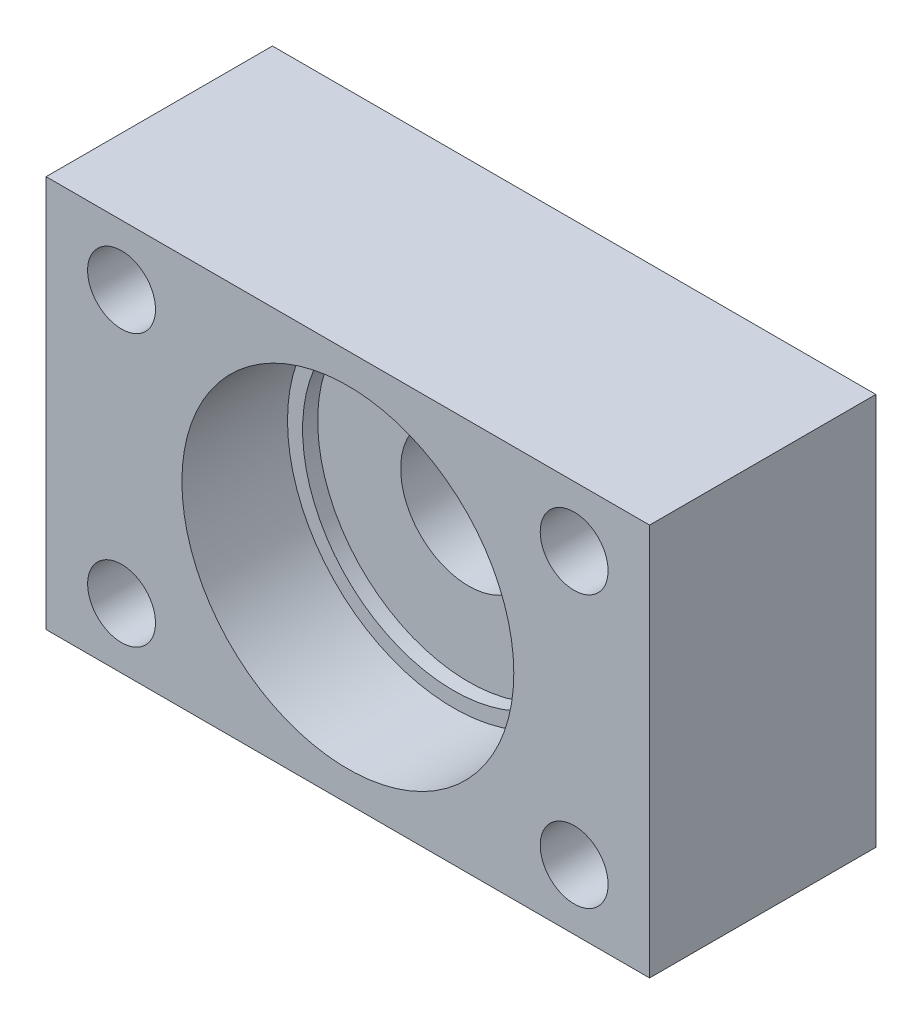
ISO-10303-21;
HEADER;
FILE_DESCRIPTION(('STEP AP214'),'2;1');
FILE_NAME('part.step','',(''),(''),'','','');
FILE_SCHEMA(('AUTOMOTIVE_DESIGN { 1 0 10303 214 1 1 1 1 }'));
ENDSEC;
DATA;
#1=APPLICATION_CONTEXT('core data for automotive mechanical design processes');
#2=APPLICATION_PROTOCOL_DEFINITION('international standard','automotive_design',2000,#1);
#3=PRODUCT_CONTEXT('',#1,'mechanical');
#4=PRODUCT('Part','Part','',(#3));
#5=PRODUCT_RELATED_PRODUCT_CATEGORY('part','',(#4));
#6=PRODUCT_DEFINITION_FORMATION('','',#4);
#7=PRODUCT_DEFINITION_CONTEXT('part definition',#1,'design');
#8=PRODUCT_DEFINITION('design','',#6,#7);
#9=PRODUCT_DEFINITION_SHAPE('','',#8);
#10=(LENGTH_UNIT() NAMED_UNIT(*) SI_UNIT(.MILLI.,.METRE.));
#11=(NAMED_UNIT(*) PLANE_ANGLE_UNIT() SI_UNIT($,.RADIAN.));
#12=(NAMED_UNIT(*) SI_UNIT($,.STERADIAN.) SOLID_ANGLE_UNIT());
#13=UNCERTAINTY_MEASURE_WITH_UNIT(LENGTH_MEASURE(1.E-05),#10,'distance_accuracy_value','');
#14=(GEOMETRIC_REPRESENTATION_CONTEXT(3) GLOBAL_UNCERTAINTY_ASSIGNED_CONTEXT((#13)) GLOBAL_UNIT_ASSIGNED_CONTEXT((#10,
#11,#12)) REPRESENTATION_CONTEXT('',''));
#15=CARTESIAN_POINT('',(0.,0.,0.));
#16=DIRECTION('',(0.,0.,1.));
#17=DIRECTION('',(1.,0.,0.));
#18=AXIS2_PLACEMENT_3D('',#15,#16,#17);
#19=CARTESIAN_POINT('',(0.,0.,15.));
#20=DIRECTION('',(1.,0.,0.));
#21=DIRECTION('',(0.,0.,-1.));
#22=AXIS2_PLACEMENT_3D('',#19,#20,#21);
#23=PLANE('',#22);
#24=DIRECTION('',(0.,-1.,0.));
#25=VECTOR('',#24,1.);
#26=CARTESIAN_POINT('',(0.,0.,0.));
#27=LINE('',#26,#25);
#28=CARTESIAN_POINT('',(0.,26.,0.));
#29=VERTEX_POINT('',#28);
#30=CARTESIAN_POINT('',(0.,0.,0.));
#31=VERTEX_POINT('',#30);
#32=EDGE_CURVE('E96',#29,#31,#27,.T.);
#33=ORIENTED_EDGE('',*,*,#32,.T.);
#34=DIRECTION('',(0.,0.,-1.));
#35=VECTOR('',#34,1.);
#36=CARTESIAN_POINT('',(0.,0.,15.));
#37=LINE('',#36,#35);
#38=CARTESIAN_POINT('',(0.,0.,15.));
#39=VERTEX_POINT('',#38);
#40=EDGE_CURVE('E11',#39,#31,#37,.T.);
#41=ORIENTED_EDGE('',*,*,#40,.F.);
#42=DIRECTION('',(0.,-1.,0.));
#43=VECTOR('',#42,1.);
#44=CARTESIAN_POINT('',(0.,0.,15.));
#45=LINE('',#44,#43);
#46=CARTESIAN_POINT('',(0.,26.,15.));
#47=VERTEX_POINT('',#46);
#48=EDGE_CURVE('E84',#47,#39,#45,.T.);
#49=ORIENTED_EDGE('',*,*,#48,.F.);
#50=DIRECTION('',(0.,0.,-1.));
#51=VECTOR('',#50,1.);
#52=CARTESIAN_POINT('',(0.,26.,15.));
#53=LINE('',#52,#51);
#54=EDGE_CURVE('E92',#47,#29,#53,.T.);
#55=ORIENTED_EDGE('',*,*,#54,.T.);
#56=EDGE_LOOP('',(#33,#41,#49,#55));
#57=FACE_BOUND('',#56,.T.);
#58=ADVANCED_FACE('F33',(#57),#23,.F.);
#59=CARTESIAN_POINT('',(0.,0.,15.));
#60=DIRECTION('',(0.,1.,0.));
#61=DIRECTION('',(0.,0.,1.));
#62=AXIS2_PLACEMENT_3D('',#59,#60,#61);
#63=PLANE('',#62);
#64=DIRECTION('',(1.,0.,0.));
#65=VECTOR('',#64,1.);
#66=CARTESIAN_POINT('',(0.,0.,0.));
#67=LINE('',#66,#65);
#68=CARTESIAN_POINT('',(40.,0.,0.));
#69=VERTEX_POINT('',#68);
#70=EDGE_CURVE('E88',#31,#69,#67,.T.);
#71=ORIENTED_EDGE('',*,*,#70,.T.);
#72=DIRECTION('',(0.,0.,-1.));
#73=VECTOR('',#72,1.);
#74=CARTESIAN_POINT('',(40.,0.,15.));
#75=LINE('',#74,#73);
#76=CARTESIAN_POINT('',(40.,0.,15.));
#77=VERTEX_POINT('',#76);
#78=EDGE_CURVE('E41',#77,#69,#75,.T.);
#79=ORIENTED_EDGE('',*,*,#78,.F.);
#80=DIRECTION('',(1.,0.,0.));
#81=VECTOR('',#80,1.);
#82=CARTESIAN_POINT('',(0.,0.,15.));
#83=LINE('',#82,#81);
#84=EDGE_CURVE('E79',#39,#77,#83,.T.);
#85=ORIENTED_EDGE('',*,*,#84,.F.);
#86=ORIENTED_EDGE('',*,*,#40,.T.);
#87=EDGE_LOOP('',(#71,#79,#85,#86));
#88=FACE_BOUND('',#87,.T.);
#89=ADVANCED_FACE('F87',(#88),#63,.F.);
#90=CARTESIAN_POINT('',(40.,0.,15.));
#91=DIRECTION('',(-1.,0.,0.));
#92=DIRECTION('',(0.,0.,1.));
#93=AXIS2_PLACEMENT_3D('',#90,#91,#92);
#94=PLANE('',#93);
#95=DIRECTION('',(0.,1.,0.));
#96=VECTOR('',#95,1.);
#97=CARTESIAN_POINT('',(40.,0.,0.));
#98=LINE('',#97,#96);
#99=CARTESIAN_POINT('',(40.,26.,0.));
#100=VERTEX_POINT('',#99);
#101=EDGE_CURVE('E66',#69,#100,#98,.T.);
#102=ORIENTED_EDGE('',*,*,#101,.T.);
#103=DIRECTION('',(0.,0.,-1.));
#104=VECTOR('',#103,1.);
#105=CARTESIAN_POINT('',(40.,26.,15.));
#106=LINE('',#105,#104);
#107=CARTESIAN_POINT('',(40.,26.,15.));
#108=VERTEX_POINT('',#107);
#109=EDGE_CURVE('E89',#108,#100,#106,.T.);
#110=ORIENTED_EDGE('',*,*,#109,.F.);
#111=DIRECTION('',(0.,1.,0.));
#112=VECTOR('',#111,1.);
#113=CARTESIAN_POINT('',(40.,0.,15.));
#114=LINE('',#113,#112);
#115=EDGE_CURVE('E82',#77,#108,#114,.T.);
#116=ORIENTED_EDGE('',*,*,#115,.F.);
#117=ORIENTED_EDGE('',*,*,#78,.T.);
#118=EDGE_LOOP('',(#102,#110,#116,#117));
#119=FACE_BOUND('',#118,.T.);
#120=ADVANCED_FACE('F90',(#119),#94,.F.);
#121=CARTESIAN_POINT('',(0.,26.,15.));
#122=DIRECTION('',(0.,-1.,0.));
#123=DIRECTION('',(0.,0.,-1.));
#124=AXIS2_PLACEMENT_3D('',#121,#122,#123);
#125=PLANE('',#124);
#126=DIRECTION('',(-1.,0.,0.));
#127=VECTOR('',#126,1.);
#128=CARTESIAN_POINT('',(0.,26.,0.));
#129=LINE('',#128,#127);
#130=EDGE_CURVE('E72',#100,#29,#129,.T.);
#131=ORIENTED_EDGE('',*,*,#130,.T.);
#132=ORIENTED_EDGE('',*,*,#54,.F.);
#133=DIRECTION('',(-1.,0.,0.));
#134=VECTOR('',#133,1.);
#135=CARTESIAN_POINT('',(0.,26.,15.));
#136=LINE('',#135,#134);
#137=EDGE_CURVE('E49',#108,#47,#136,.T.);
#138=ORIENTED_EDGE('',*,*,#137,.F.);
#139=ORIENTED_EDGE('',*,*,#109,.T.);
#140=EDGE_LOOP('',(#131,#132,#138,#139));
#141=FACE_BOUND('',#140,.T.);
#142=ADVANCED_FACE('F104',(#141),#125,.F.);
#143=CARTESIAN_POINT('',(0.,0.,15.));
#144=DIRECTION('',(0.,0.,-1.));
#145=DIRECTION('',(-1.,0.,0.));
#146=AXIS2_PLACEMENT_3D('',#143,#144,#145);
#147=PLANE('',#146);
#148=CARTESIAN_POINT('',(5.,4.,15.));
#149=DIRECTION('',(0.,0.,1.));
#150=DIRECTION('',(-1.,0.,0.));
#151=AXIS2_PLACEMENT_3D('',#148,#149,#150);
#152=CIRCLE('',#151,2.25);
#153=CARTESIAN_POINT('',(2.75,4.,15.));
#154=VERTEX_POINT('',#153);
#155=EDGE_CURVE('E146',#154,#154,#152,.T.);
#156=ORIENTED_EDGE('',*,*,#155,.F.);
#157=EDGE_LOOP('',(#156));
#158=FACE_BOUND('',#157,.T.);
#159=CARTESIAN_POINT('',(35.,4.,15.));
#160=DIRECTION('',(0.,0.,1.));
#161=DIRECTION('',(1.,0.,0.));
#162=AXIS2_PLACEMENT_3D('',#159,#160,#161);
#163=CIRCLE('',#162,2.25);
#164=CARTESIAN_POINT('',(37.25,4.,15.));
#165=VERTEX_POINT('',#164);
#166=EDGE_CURVE('E140',#165,#165,#163,.T.);
#167=ORIENTED_EDGE('',*,*,#166,.F.);
#168=EDGE_LOOP('',(#167));
#169=FACE_BOUND('',#168,.T.);
#170=CARTESIAN_POINT('',(35.,22.,15.));
#171=DIRECTION('',(0.,0.,1.));
#172=DIRECTION('',(-1.,0.,0.));
#173=AXIS2_PLACEMENT_3D('',#170,#171,#172);
#174=CIRCLE('',#173,2.25);
#175=CARTESIAN_POINT('',(32.75,22.,15.));
#176=VERTEX_POINT('',#175);
#177=EDGE_CURVE('E134',#176,#176,#174,.T.);
#178=ORIENTED_EDGE('',*,*,#177,.F.);
#179=EDGE_LOOP('',(#178));
#180=FACE_BOUND('',#179,.T.);
#181=CARTESIAN_POINT('',(5.,22.,15.));
#182=DIRECTION('',(0.,0.,1.));
#183=DIRECTION('',(1.,0.,0.));
#184=AXIS2_PLACEMENT_3D('',#181,#182,#183);
#185=CIRCLE('',#184,2.25);
#186=CARTESIAN_POINT('',(7.25,22.,15.));
#187=VERTEX_POINT('',#186);
#188=EDGE_CURVE('E128',#187,#187,#185,.T.);
#189=ORIENTED_EDGE('',*,*,#188,.F.);
#190=EDGE_LOOP('',(#189));
#191=FACE_BOUND('',#190,.T.);
#192=CARTESIAN_POINT('',(20.,13.,15.));
#193=DIRECTION('',(0.,0.,1.));
#194=DIRECTION('',(1.,0.,0.));
#195=AXIS2_PLACEMENT_3D('',#192,#193,#194);
#196=CIRCLE('',#195,11.);
#197=CARTESIAN_POINT('',(31.,13.,15.));
#198=VERTEX_POINT('',#197);
#199=EDGE_CURVE('E110',#198,#198,#196,.T.);
#200=ORIENTED_EDGE('',*,*,#199,.F.);
#201=EDGE_LOOP('',(#200));
#202=FACE_BOUND('',#201,.T.);
#203=ORIENTED_EDGE('',*,*,#48,.T.);
#204=ORIENTED_EDGE('',*,*,#84,.T.);
#205=ORIENTED_EDGE('',*,*,#115,.T.);
#206=ORIENTED_EDGE('',*,*,#137,.T.);
#207=EDGE_LOOP('',(#203,#204,#205,#206));
#208=FACE_BOUND('',#207,.T.);
#209=ADVANCED_FACE('F80',(#158,#169,#180,#191,#202,#208),#147,.F.);
#210=CARTESIAN_POINT('',(0.,0.,0.));
#211=DIRECTION('',(0.,0.,-1.));
#212=DIRECTION('',(-1.,0.,0.));
#213=AXIS2_PLACEMENT_3D('',#210,#211,#212);
#214=PLANE('',#213);
#215=CARTESIAN_POINT('',(5.,4.,0.));
#216=DIRECTION('',(0.,0.,1.));
#217=DIRECTION('',(-1.,0.,0.));
#218=AXIS2_PLACEMENT_3D('',#215,#216,#217);
#219=CIRCLE('',#218,2.25);
#220=CARTESIAN_POINT('',(2.75,4.,0.));
#221=VERTEX_POINT('',#220);
#222=EDGE_CURVE('E131',#221,#221,#219,.T.);
#223=ORIENTED_EDGE('',*,*,#222,.T.);
#224=EDGE_LOOP('',(#223));
#225=FACE_BOUND('',#224,.T.);
#226=CARTESIAN_POINT('',(35.,4.,0.));
#227=DIRECTION('',(0.,0.,1.));
#228=DIRECTION('',(1.,0.,0.));
#229=AXIS2_PLACEMENT_3D('',#226,#227,#228);
#230=CIRCLE('',#229,2.25);
#231=CARTESIAN_POINT('',(37.25,4.,0.));
#232=VERTEX_POINT('',#231);
#233=EDGE_CURVE('E143',#232,#232,#230,.T.);
#234=ORIENTED_EDGE('',*,*,#233,.T.);
#235=EDGE_LOOP('',(#234));
#236=FACE_BOUND('',#235,.T.);
#237=CARTESIAN_POINT('',(35.,22.,0.));
#238=DIRECTION('',(0.,0.,1.));
#239=DIRECTION('',(-1.,0.,0.));
#240=AXIS2_PLACEMENT_3D('',#237,#238,#239);
#241=CIRCLE('',#240,2.25);
#242=CARTESIAN_POINT('',(32.75,22.,0.));
#243=VERTEX_POINT('',#242);
#244=EDGE_CURVE('E137',#243,#243,#241,.T.);
#245=ORIENTED_EDGE('',*,*,#244,.T.);
#246=EDGE_LOOP('',(#245));
#247=FACE_BOUND('',#246,.T.);
#248=CARTESIAN_POINT('',(5.,22.,0.));
#249=DIRECTION('',(0.,0.,1.));
#250=DIRECTION('',(1.,0.,0.));
#251=AXIS2_PLACEMENT_3D('',#248,#249,#250);
#252=CIRCLE('',#251,2.25);
#253=CARTESIAN_POINT('',(7.25,22.,0.));
#254=VERTEX_POINT('',#253);
#255=EDGE_CURVE('E125',#254,#254,#252,.T.);
#256=ORIENTED_EDGE('',*,*,#255,.T.);
#257=EDGE_LOOP('',(#256));
#258=FACE_BOUND('',#257,.T.);
#259=CARTESIAN_POINT('',(20.,13.,0.));
#260=DIRECTION('',(0.,0.,1.));
#261=DIRECTION('',(1.,0.,0.));
#262=AXIS2_PLACEMENT_3D('',#259,#260,#261);
#263=CIRCLE('',#262,4.5);
#264=CARTESIAN_POINT('',(24.5,13.,0.));
#265=VERTEX_POINT('',#264);
#266=EDGE_CURVE('E119',#265,#265,#263,.T.);
#267=ORIENTED_EDGE('',*,*,#266,.T.);
#268=EDGE_LOOP('',(#267));
#269=FACE_BOUND('',#268,.T.);
#270=ORIENTED_EDGE('',*,*,#32,.F.);
#271=ORIENTED_EDGE('',*,*,#130,.F.);
#272=ORIENTED_EDGE('',*,*,#101,.F.);
#273=ORIENTED_EDGE('',*,*,#70,.F.);
#274=EDGE_LOOP('',(#270,#271,#272,#273));
#275=FACE_BOUND('',#274,.T.);
#276=ADVANCED_FACE('F107',(#225,#236,#247,#258,#269,#275),#214,.T.);
#277=CARTESIAN_POINT('',(20.,13.,8.));
#278=DIRECTION('',(0.,0.,1.));
#279=DIRECTION('',(1.,0.,0.));
#280=AXIS2_PLACEMENT_3D('',#277,#278,#279);
#281=CYLINDRICAL_SURFACE('',#280,11.);
#282=CARTESIAN_POINT('',(20.,13.,8.));
#283=DIRECTION('',(0.,0.,1.));
#284=DIRECTION('',(1.,0.,0.));
#285=AXIS2_PLACEMENT_3D('',#282,#283,#284);
#286=CIRCLE('',#285,11.);
#287=CARTESIAN_POINT('',(31.,13.,8.));
#288=VERTEX_POINT('',#287);
#289=EDGE_CURVE('E99',#288,#288,#286,.T.);
#290=ORIENTED_EDGE('',*,*,#289,.F.);
#291=EDGE_LOOP('',(#290));
#292=FACE_BOUND('',#291,.T.);
#293=ORIENTED_EDGE('',*,*,#199,.T.);
#294=EDGE_LOOP('',(#293));
#295=FACE_BOUND('',#294,.T.);
#296=ADVANCED_FACE('F172',(#292,#295),#281,.F.);
#297=CARTESIAN_POINT('',(20.,13.,8.));
#298=DIRECTION('',(0.,0.,1.));
#299=DIRECTION('',(1.,0.,0.));
#300=AXIS2_PLACEMENT_3D('',#297,#298,#299);
#301=PLANE('',#300);
#302=CARTESIAN_POINT('',(20.,13.,8.));
#303=DIRECTION('',(0.,0.,1.));
#304=DIRECTION('',(1.,0.,0.));
#305=AXIS2_PLACEMENT_3D('',#302,#303,#304);
#306=CIRCLE('',#305,10.);
#307=CARTESIAN_POINT('',(30.,13.,8.));
#308=VERTEX_POINT('',#307);
#309=EDGE_CURVE('E116',#308,#308,#306,.T.);
#310=ORIENTED_EDGE('',*,*,#309,.F.);
#311=EDGE_LOOP('',(#310));
#312=FACE_BOUND('',#311,.T.);
#313=ORIENTED_EDGE('',*,*,#289,.T.);
#314=EDGE_LOOP('',(#313));
#315=FACE_BOUND('',#314,.T.);
#316=ADVANCED_FACE('F174',(#312,#315),#301,.T.);
#317=CARTESIAN_POINT('',(20.,13.,7.));
#318=DIRECTION('',(0.,0.,1.));
#319=DIRECTION('',(1.,0.,0.));
#320=AXIS2_PLACEMENT_3D('',#317,#318,#319);
#321=CYLINDRICAL_SURFACE('',#320,10.);
#322=CARTESIAN_POINT('',(20.,13.,7.));
#323=DIRECTION('',(0.,0.,1.));
#324=DIRECTION('',(1.,0.,0.));
#325=AXIS2_PLACEMENT_3D('',#322,#323,#324);
#326=CIRCLE('',#325,10.);
#327=CARTESIAN_POINT('',(30.,13.,7.));
#328=VERTEX_POINT('',#327);
#329=EDGE_CURVE('E113',#328,#328,#326,.T.);
#330=ORIENTED_EDGE('',*,*,#329,.F.);
#331=EDGE_LOOP('',(#330));
#332=FACE_BOUND('',#331,.T.);
#333=ORIENTED_EDGE('',*,*,#309,.T.);
#334=EDGE_LOOP('',(#333));
#335=FACE_BOUND('',#334,.T.);
#336=ADVANCED_FACE('F181',(#332,#335),#321,.F.);
#337=CARTESIAN_POINT('',(20.,13.,7.));
#338=DIRECTION('',(0.,0.,1.));
#339=DIRECTION('',(1.,0.,0.));
#340=AXIS2_PLACEMENT_3D('',#337,#338,#339);
#341=PLANE('',#340);
#342=CARTESIAN_POINT('',(20.,13.,7.));
#343=DIRECTION('',(0.,0.,1.));
#344=DIRECTION('',(1.,0.,0.));
#345=AXIS2_PLACEMENT_3D('',#342,#343,#344);
#346=CIRCLE('',#345,4.5);
#347=CARTESIAN_POINT('',(24.5,13.,7.));
#348=VERTEX_POINT('',#347);
#349=EDGE_CURVE('E122',#348,#348,#346,.T.);
#350=ORIENTED_EDGE('',*,*,#349,.F.);
#351=EDGE_LOOP('',(#350));
#352=FACE_BOUND('',#351,.T.);
#353=ORIENTED_EDGE('',*,*,#329,.T.);
#354=EDGE_LOOP('',(#353));
#355=FACE_BOUND('',#354,.T.);
#356=ADVANCED_FACE('F256',(#352,#355),#341,.T.);
#357=CARTESIAN_POINT('',(20.,13.,0.));
#358=DIRECTION('',(0.,0.,1.));
#359=DIRECTION('',(1.,0.,0.));
#360=AXIS2_PLACEMENT_3D('',#357,#358,#359);
#361=CYLINDRICAL_SURFACE('',#360,4.5);
#362=ORIENTED_EDGE('',*,*,#266,.F.);
#363=EDGE_LOOP('',(#362));
#364=FACE_BOUND('',#363,.T.);
#365=ORIENTED_EDGE('',*,*,#349,.T.);
#366=EDGE_LOOP('',(#365));
#367=FACE_BOUND('',#366,.T.);
#368=ADVANCED_FACE('F221',(#364,#367),#361,.F.);
#369=CARTESIAN_POINT('',(5.,22.,0.));
#370=DIRECTION('',(0.,0.,1.));
#371=DIRECTION('',(1.,0.,0.));
#372=AXIS2_PLACEMENT_3D('',#369,#370,#371);
#373=CYLINDRICAL_SURFACE('',#372,2.25);
#374=ORIENTED_EDGE('',*,*,#255,.F.);
#375=EDGE_LOOP('',(#374));
#376=FACE_BOUND('',#375,.T.);
#377=ORIENTED_EDGE('',*,*,#188,.T.);
#378=EDGE_LOOP('',(#377));
#379=FACE_BOUND('',#378,.T.);
#380=ADVANCED_FACE('F215',(#376,#379),#373,.F.);
#381=CARTESIAN_POINT('',(35.,22.,0.));
#382=DIRECTION('',(0.,0.,1.));
#383=DIRECTION('',(1.,0.,0.));
#384=AXIS2_PLACEMENT_3D('',#381,#382,#383);
#385=CYLINDRICAL_SURFACE('',#384,2.25);
#386=ORIENTED_EDGE('',*,*,#244,.F.);
#387=EDGE_LOOP('',(#386));
#388=FACE_BOUND('',#387,.T.);
#389=ORIENTED_EDGE('',*,*,#177,.T.);
#390=EDGE_LOOP('',(#389));
#391=FACE_BOUND('',#390,.T.);
#392=ADVANCED_FACE('F220',(#388,#391),#385,.F.);
#393=CARTESIAN_POINT('',(35.,4.,0.));
#394=DIRECTION('',(0.,0.,1.));
#395=DIRECTION('',(1.,0.,0.));
#396=AXIS2_PLACEMENT_3D('',#393,#394,#395);
#397=CYLINDRICAL_SURFACE('',#396,2.25);
#398=ORIENTED_EDGE('',*,*,#233,.F.);
#399=EDGE_LOOP('',(#398));
#400=FACE_BOUND('',#399,.T.);
#401=ORIENTED_EDGE('',*,*,#166,.T.);
#402=EDGE_LOOP('',(#401));
#403=FACE_BOUND('',#402,.T.);
#404=ADVANCED_FACE('F157',(#400,#403),#397,.F.);
#405=CARTESIAN_POINT('',(5.,4.,0.));
#406=DIRECTION('',(0.,0.,1.));
#407=DIRECTION('',(1.,0.,0.));
#408=AXIS2_PLACEMENT_3D('',#405,#406,#407);
#409=CYLINDRICAL_SURFACE('',#408,2.25);
#410=ORIENTED_EDGE('',*,*,#222,.F.);
#411=EDGE_LOOP('',(#410));
#412=FACE_BOUND('',#411,.T.);
#413=ORIENTED_EDGE('',*,*,#155,.T.);
#414=EDGE_LOOP('',(#413));
#415=FACE_BOUND('',#414,.T.);
#416=ADVANCED_FACE('F154',(#412,#415),#409,.F.);
#417=CLOSED_SHELL('',(#58,#89,#120,#142,#209,#276,#296,#316,#336,#356,#368,#380,#392,#404,#416));
#418=MANIFOLD_SOLID_BREP('B2',#417);
#419=ADVANCED_BREP_SHAPE_REPRESENTATION('',(#18,#418),#14);
#420=SHAPE_DEFINITION_REPRESENTATION(#9,#419);
ENDSEC;
END-ISO-10303-21;
